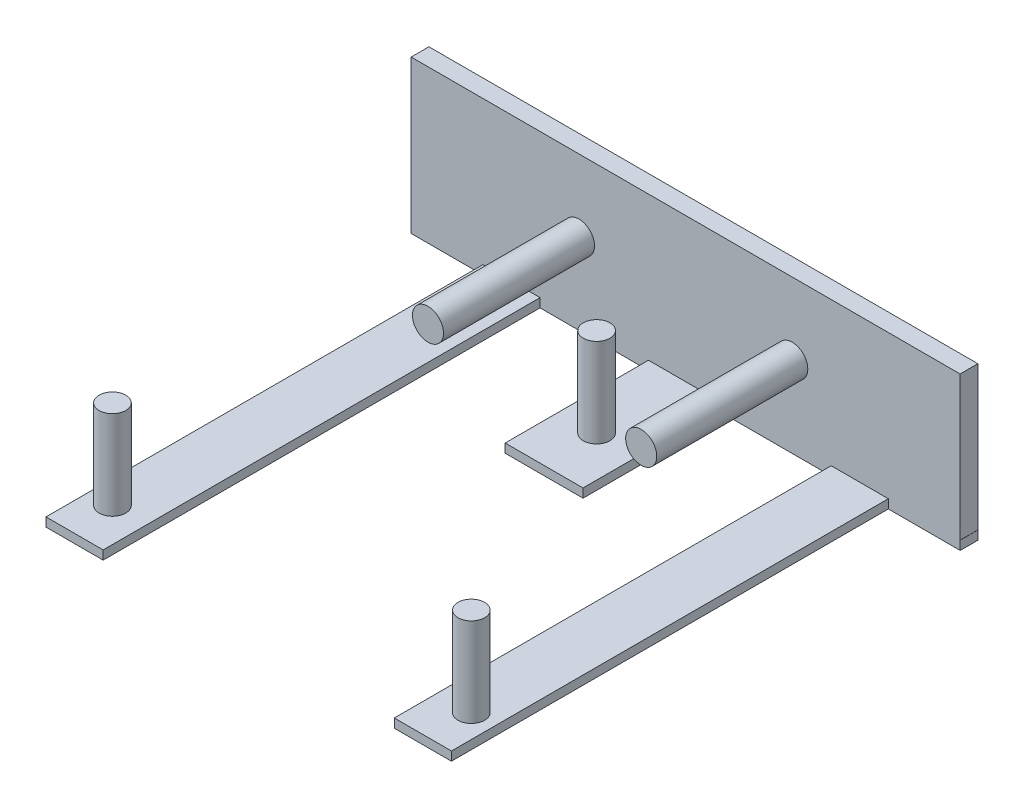
ISO-10303-21;
HEADER;
FILE_DESCRIPTION(('STEP AP214'),'2;1');
FILE_NAME('part.step','',(''),(''),'','','');
FILE_SCHEMA(('AUTOMOTIVE_DESIGN { 1 0 10303 214 1 1 1 1 }'));
ENDSEC;
DATA;
#1=APPLICATION_CONTEXT('core data for automotive mechanical design processes');
#2=APPLICATION_PROTOCOL_DEFINITION('international standard','automotive_design',2000,#1);
#3=PRODUCT_CONTEXT('',#1,'mechanical');
#4=PRODUCT('Part','Part','',(#3));
#5=PRODUCT_RELATED_PRODUCT_CATEGORY('part','',(#4));
#6=PRODUCT_DEFINITION_FORMATION('','',#4);
#7=PRODUCT_DEFINITION_CONTEXT('part definition',#1,'design');
#8=PRODUCT_DEFINITION('design','',#6,#7);
#9=PRODUCT_DEFINITION_SHAPE('','',#8);
#10=(LENGTH_UNIT() NAMED_UNIT(*) SI_UNIT(.MILLI.,.METRE.));
#11=(NAMED_UNIT(*) PLANE_ANGLE_UNIT() SI_UNIT($,.RADIAN.));
#12=(NAMED_UNIT(*) SI_UNIT($,.STERADIAN.) SOLID_ANGLE_UNIT());
#13=UNCERTAINTY_MEASURE_WITH_UNIT(LENGTH_MEASURE(1.E-05),#10,'distance_accuracy_value','');
#14=(GEOMETRIC_REPRESENTATION_CONTEXT(3) GLOBAL_UNCERTAINTY_ASSIGNED_CONTEXT((#13)) GLOBAL_UNIT_ASSIGNED_CONTEXT((#10,
#11,#12)) REPRESENTATION_CONTEXT('',''));
#15=CARTESIAN_POINT('',(0.,0.,0.));
#16=DIRECTION('',(0.,0.,1.));
#17=DIRECTION('',(1.,0.,0.));
#18=AXIS2_PLACEMENT_3D('',#15,#16,#17);
#19=CARTESIAN_POINT('',(11.1297221585432,-14.732,-43.18));
#20=DIRECTION('',(-1.,0.,0.));
#21=DIRECTION('',(0.,0.,1.));
#22=AXIS2_PLACEMENT_3D('',#19,#20,#21);
#23=PLANE('',#22);
#24=DIRECTION('',(0.,-1.,0.));
#25=VECTOR('',#24,1.);
#26=CARTESIAN_POINT('',(11.1297221585432,-14.732,-38.1));
#27=LINE('',#26,#25);
#28=CARTESIAN_POINT('',(11.1297221585432,-12.192,-38.1));
#29=VERTEX_POINT('',#28);
#30=CARTESIAN_POINT('',(11.1297221585432,-14.732,-38.1));
#31=VERTEX_POINT('',#30);
#32=EDGE_CURVE('E208',#29,#31,#27,.T.);
#33=ORIENTED_EDGE('',*,*,#32,.F.);
#34=DIRECTION('',(0.,0.,1.));
#35=VECTOR('',#34,1.);
#36=CARTESIAN_POINT('',(11.1297221585432,-12.192,-43.18));
#37=LINE('',#36,#35);
#38=CARTESIAN_POINT('',(11.1297221585432,-12.192,2.87258329002782));
#39=VERTEX_POINT('',#38);
#40=EDGE_CURVE('E248',#29,#39,#37,.T.);
#41=ORIENTED_EDGE('',*,*,#40,.T.);
#42=DIRECTION('',(0.,1.,0.));
#43=VECTOR('',#42,1.);
#44=CARTESIAN_POINT('',(11.1297221585432,-14.732,2.87258329002782));
#45=LINE('',#44,#43);
#46=CARTESIAN_POINT('',(11.1297221585432,-14.732,2.87258329002782));
#47=VERTEX_POINT('',#46);
#48=EDGE_CURVE('E265',#47,#39,#45,.T.);
#49=ORIENTED_EDGE('',*,*,#48,.F.);
#50=DIRECTION('',(0.,0.,1.));
#51=VECTOR('',#50,1.);
#52=CARTESIAN_POINT('',(11.1297221585432,-14.732,-43.18));
#53=LINE('',#52,#51);
#54=EDGE_CURVE('E48',#31,#47,#53,.T.);
#55=ORIENTED_EDGE('',*,*,#54,.F.);
#56=EDGE_LOOP('',(#33,#41,#49,#55));
#57=FACE_BOUND('',#56,.T.);
#58=ADVANCED_FACE('F33',(#57),#23,.F.);
#59=CARTESIAN_POINT('',(-11.1297221585431,-14.732,-43.18));
#60=DIRECTION('',(1.,0.,0.));
#61=DIRECTION('',(0.,0.,-1.));
#62=AXIS2_PLACEMENT_3D('',#59,#60,#61);
#63=PLANE('',#62);
#64=DIRECTION('',(0.,1.,0.));
#65=VECTOR('',#64,1.);
#66=CARTESIAN_POINT('',(-11.1297221585431,-14.732,-38.1));
#67=LINE('',#66,#65);
#68=CARTESIAN_POINT('',(-11.1297221585431,-14.732,-38.1));
#69=VERTEX_POINT('',#68);
#70=CARTESIAN_POINT('',(-11.1297221585431,-12.192,-38.1));
#71=VERTEX_POINT('',#70);
#72=EDGE_CURVE('E206',#69,#71,#67,.T.);
#73=ORIENTED_EDGE('',*,*,#72,.F.);
#74=DIRECTION('',(0.,0.,-1.));
#75=VECTOR('',#74,1.);
#76=CARTESIAN_POINT('',(-11.1297221585431,-14.732,-43.18));
#77=LINE('',#76,#75);
#78=CARTESIAN_POINT('',(-11.1297221585431,-14.732,2.87258329002782));
#79=VERTEX_POINT('',#78);
#80=EDGE_CURVE('E253',#79,#69,#77,.T.);
#81=ORIENTED_EDGE('',*,*,#80,.F.);
#82=DIRECTION('',(0.,1.,0.));
#83=VECTOR('',#82,1.);
#84=CARTESIAN_POINT('',(-11.1297221585431,-14.732,2.87258329002782));
#85=LINE('',#84,#83);
#86=CARTESIAN_POINT('',(-11.1297221585431,-12.192,2.87258329002782));
#87=VERTEX_POINT('',#86);
#88=EDGE_CURVE('E257',#79,#87,#85,.T.);
#89=ORIENTED_EDGE('',*,*,#88,.T.);
#90=DIRECTION('',(0.,0.,-1.));
#91=VECTOR('',#90,1.);
#92=CARTESIAN_POINT('',(-11.1297221585431,-12.192,-43.18));
#93=LINE('',#92,#91);
#94=EDGE_CURVE('E251',#87,#71,#93,.T.);
#95=ORIENTED_EDGE('',*,*,#94,.T.);
#96=EDGE_LOOP('',(#73,#81,#89,#95));
#97=FACE_BOUND('',#96,.T.);
#98=ADVANCED_FACE('F320',(#97),#63,.F.);
#99=CARTESIAN_POINT('',(-58.4650440307115,-14.732,-43.18));
#100=DIRECTION('',(1.,0.,0.));
#101=DIRECTION('',(0.,0.,-1.));
#102=AXIS2_PLACEMENT_3D('',#99,#100,#101);
#103=PLANE('',#102);
#104=DIRECTION('',(0.,1.,0.));
#105=VECTOR('',#104,1.);
#106=CARTESIAN_POINT('',(-58.4650440307115,-14.732,-38.1));
#107=LINE('',#106,#105);
#108=CARTESIAN_POINT('',(-58.4650440307115,-14.732,-38.1));
#109=VERTEX_POINT('',#108);
#110=CARTESIAN_POINT('',(-58.4650440307115,-12.192,-38.1));
#111=VERTEX_POINT('',#110);
#112=EDGE_CURVE('E204',#109,#111,#107,.T.);
#113=ORIENTED_EDGE('',*,*,#112,.F.);
#114=DIRECTION('',(0.,0.,-1.));
#115=VECTOR('',#114,1.);
#116=CARTESIAN_POINT('',(-58.4650440307115,-14.732,-43.18));
#117=LINE('',#116,#115);
#118=CARTESIAN_POINT('',(-58.4650440307115,-14.732,86.8038586522886));
#119=VERTEX_POINT('',#118);
#120=EDGE_CURVE('E175',#119,#109,#117,.T.);
#121=ORIENTED_EDGE('',*,*,#120,.F.);
#122=DIRECTION('',(0.,1.,0.));
#123=VECTOR('',#122,1.);
#124=CARTESIAN_POINT('',(-58.4650440307115,-14.732,86.8038586522886));
#125=LINE('',#124,#123);
#126=CARTESIAN_POINT('',(-58.4650440307115,-12.192,86.8038586522886));
#127=VERTEX_POINT('',#126);
#128=EDGE_CURVE('E237',#119,#127,#125,.T.);
#129=ORIENTED_EDGE('',*,*,#128,.T.);
#130=DIRECTION('',(0.,0.,-1.));
#131=VECTOR('',#130,1.);
#132=CARTESIAN_POINT('',(-58.4650440307115,-12.192,-43.18));
#133=LINE('',#132,#131);
#134=EDGE_CURVE('E230',#127,#111,#133,.T.);
#135=ORIENTED_EDGE('',*,*,#134,.T.);
#136=EDGE_LOOP('',(#113,#121,#129,#135));
#137=FACE_BOUND('',#136,.T.);
#138=ADVANCED_FACE('F325',(#137),#103,.F.);
#139=CARTESIAN_POINT('',(-42.1262051769054,-14.732,-43.18));
#140=DIRECTION('',(-1.,0.,0.));
#141=DIRECTION('',(0.,0.,1.));
#142=AXIS2_PLACEMENT_3D('',#139,#140,#141);
#143=PLANE('',#142);
#144=DIRECTION('',(0.,-1.,0.));
#145=VECTOR('',#144,1.);
#146=CARTESIAN_POINT('',(-42.1262051769054,-14.732,-38.1));
#147=LINE('',#146,#145);
#148=CARTESIAN_POINT('',(-42.1262051769054,-12.192,-38.1));
#149=VERTEX_POINT('',#148);
#150=CARTESIAN_POINT('',(-42.1262051769054,-14.732,-38.1));
#151=VERTEX_POINT('',#150);
#152=EDGE_CURVE('E202',#149,#151,#147,.T.);
#153=ORIENTED_EDGE('',*,*,#152,.F.);
#154=DIRECTION('',(0.,0.,1.));
#155=VECTOR('',#154,1.);
#156=CARTESIAN_POINT('',(-42.1262051769054,-12.192,-43.18));
#157=LINE('',#156,#155);
#158=CARTESIAN_POINT('',(-42.1262051769054,-12.192,86.8038586522886));
#159=VERTEX_POINT('',#158);
#160=EDGE_CURVE('E240',#149,#159,#157,.T.);
#161=ORIENTED_EDGE('',*,*,#160,.T.);
#162=DIRECTION('',(0.,1.,0.));
#163=VECTOR('',#162,1.);
#164=CARTESIAN_POINT('',(-42.1262051769054,-14.732,86.8038586522886));
#165=LINE('',#164,#163);
#166=CARTESIAN_POINT('',(-42.1262051769054,-14.732,86.8038586522886));
#167=VERTEX_POINT('',#166);
#168=EDGE_CURVE('E245',#167,#159,#165,.T.);
#169=ORIENTED_EDGE('',*,*,#168,.F.);
#170=DIRECTION('',(0.,0.,1.));
#171=VECTOR('',#170,1.);
#172=CARTESIAN_POINT('',(-42.1262051769054,-14.732,-43.18));
#173=LINE('',#172,#171);
#174=EDGE_CURVE('E232',#151,#167,#173,.T.);
#175=ORIENTED_EDGE('',*,*,#174,.F.);
#176=EDGE_LOOP('',(#153,#161,#169,#175));
#177=FACE_BOUND('',#176,.T.);
#178=ADVANCED_FACE('F400',(#177),#143,.F.);
#179=CARTESIAN_POINT('',(57.4432840372022,-14.732,-43.1800000000001));
#180=DIRECTION('',(1.,0.,0.));
#181=DIRECTION('',(0.,0.,-1.));
#182=AXIS2_PLACEMENT_3D('',#179,#180,#181);
#183=PLANE('',#182);
#184=DIRECTION('',(0.,0.,-1.));
#185=VECTOR('',#184,1.);
#186=CARTESIAN_POINT('',(57.4432840372022,-14.732,-43.1800000000001));
#187=LINE('',#186,#185);
#188=CARTESIAN_POINT('',(57.4432840372024,-14.732,86.8038586522885));
#189=VERTEX_POINT('',#188);
#190=CARTESIAN_POINT('',(57.4432840372022,-14.732,-38.1));
#191=VERTEX_POINT('',#190);
#192=EDGE_CURVE('E211',#189,#191,#187,.T.);
#193=ORIENTED_EDGE('',*,*,#192,.T.);
#194=DIRECTION('',(0.,1.,0.));
#195=VECTOR('',#194,1.);
#196=CARTESIAN_POINT('',(57.4432840372022,-14.732,-38.1));
#197=LINE('',#196,#195);
#198=CARTESIAN_POINT('',(57.4432840372024,-12.192,-38.1));
#199=VERTEX_POINT('',#198);
#200=EDGE_CURVE('E200',#191,#199,#197,.T.);
#201=ORIENTED_EDGE('',*,*,#200,.T.);
#202=DIRECTION('',(0.,0.,-1.));
#203=VECTOR('',#202,1.);
#204=CARTESIAN_POINT('',(57.4432840372022,-12.192,-43.1800000000001));
#205=LINE('',#204,#203);
#206=CARTESIAN_POINT('',(57.4432840372024,-12.192,86.8038586522885));
#207=VERTEX_POINT('',#206);
#208=EDGE_CURVE('E210',#207,#199,#205,.T.);
#209=ORIENTED_EDGE('',*,*,#208,.F.);
#210=DIRECTION('',(0.,1.,0.));
#211=VECTOR('',#210,1.);
#212=CARTESIAN_POINT('',(57.4432840372024,-14.732,86.8038586522885));
#213=LINE('',#212,#211);
#214=EDGE_CURVE('E228',#189,#207,#213,.T.);
#215=ORIENTED_EDGE('',*,*,#214,.F.);
#216=EDGE_LOOP('',(#193,#201,#209,#215));
#217=FACE_BOUND('',#216,.T.);
#218=ADVANCED_FACE('F402',(#217),#183,.T.);
#219=CARTESIAN_POINT('',(41.1044451833961,-14.732,-43.1800000000001));
#220=DIRECTION('',(-1.,0.,0.));
#221=DIRECTION('',(0.,0.,1.));
#222=AXIS2_PLACEMENT_3D('',#219,#220,#221);
#223=PLANE('',#222);
#224=DIRECTION('',(0.,0.,1.));
#225=VECTOR('',#224,1.);
#226=CARTESIAN_POINT('',(41.1044451833961,-12.192,-43.1800000000001));
#227=LINE('',#226,#225);
#228=CARTESIAN_POINT('',(41.1044451833961,-12.192,-38.1));
#229=VERTEX_POINT('',#228);
#230=CARTESIAN_POINT('',(41.1044451833963,-12.192,86.8038586522885));
#231=VERTEX_POINT('',#230);
#232=EDGE_CURVE('E214',#229,#231,#227,.T.);
#233=ORIENTED_EDGE('',*,*,#232,.F.);
#234=DIRECTION('',(0.,-1.,0.));
#235=VECTOR('',#234,1.);
#236=CARTESIAN_POINT('',(41.1044451833961,-14.732,-38.1));
#237=LINE('',#236,#235);
#238=CARTESIAN_POINT('',(41.1044451833961,-14.732,-38.1));
#239=VERTEX_POINT('',#238);
#240=EDGE_CURVE('E197',#229,#239,#237,.T.);
#241=ORIENTED_EDGE('',*,*,#240,.T.);
#242=DIRECTION('',(0.,0.,1.));
#243=VECTOR('',#242,1.);
#244=CARTESIAN_POINT('',(41.1044451833961,-14.732,-43.1800000000001));
#245=LINE('',#244,#243);
#246=CARTESIAN_POINT('',(41.1044451833963,-14.732,86.8038586522885));
#247=VERTEX_POINT('',#246);
#248=EDGE_CURVE('E217',#239,#247,#245,.T.);
#249=ORIENTED_EDGE('',*,*,#248,.T.);
#250=DIRECTION('',(0.,1.,0.));
#251=VECTOR('',#250,1.);
#252=CARTESIAN_POINT('',(41.1044451833963,-14.732,86.8038586522885));
#253=LINE('',#252,#251);
#254=EDGE_CURVE('E219',#247,#231,#253,.T.);
#255=ORIENTED_EDGE('',*,*,#254,.T.);
#256=EDGE_LOOP('',(#233,#241,#249,#255));
#257=FACE_BOUND('',#256,.T.);
#258=ADVANCED_FACE('F310',(#257),#223,.T.);
#259=CARTESIAN_POINT('',(29.9691200032454,8.382,-38.1));
#260=DIRECTION('',(0.,0.,1.));
#261=DIRECTION('',(1.,0.,0.));
#262=AXIS2_PLACEMENT_3D('',#259,#260,#261);
#263=CYLINDRICAL_SURFACE('',#262,4.445);
#264=CARTESIAN_POINT('',(29.9691200032454,8.382,-38.1));
#265=DIRECTION('',(0.,0.,1.));
#266=DIRECTION('',(1.,0.,0.));
#267=AXIS2_PLACEMENT_3D('',#264,#265,#266);
#268=CIRCLE('',#267,4.445);
#269=CARTESIAN_POINT('',(34.4141200032454,8.382,-38.1));
#270=VERTEX_POINT('',#269);
#271=EDGE_CURVE('E290',#270,#270,#268,.F.);
#272=ORIENTED_EDGE('',*,*,#271,.F.);
#273=EDGE_LOOP('',(#272));
#274=FACE_BOUND('',#273,.T.);
#275=CARTESIAN_POINT('',(29.9691200032454,8.382,5.08));
#276=DIRECTION('',(0.,0.,1.));
#277=DIRECTION('',(1.,0.,0.));
#278=AXIS2_PLACEMENT_3D('',#275,#276,#277);
#279=CIRCLE('',#278,4.445);
#280=CARTESIAN_POINT('',(34.4141200032454,8.382,5.08));
#281=VERTEX_POINT('',#280);
#282=EDGE_CURVE('E293',#281,#281,#279,.T.);
#283=ORIENTED_EDGE('',*,*,#282,.F.);
#284=EDGE_LOOP('',(#283));
#285=FACE_BOUND('',#284,.T.);
#286=ADVANCED_FACE('F35',(#274,#285),#263,.T.);
#287=CARTESIAN_POINT('',(29.9691200032454,8.382,5.08));
#288=DIRECTION('',(0.,0.,1.));
#289=DIRECTION('',(1.,0.,0.));
#290=AXIS2_PLACEMENT_3D('',#287,#288,#289);
#291=PLANE('',#290);
#292=ORIENTED_EDGE('',*,*,#282,.T.);
#293=EDGE_LOOP('',(#292));
#294=FACE_BOUND('',#293,.T.);
#295=ADVANCED_FACE('F309',(#294),#291,.T.);
#296=CARTESIAN_POINT('',(-78.9758169935736,-12.192,-43.18));
#297=DIRECTION('',(1.,0.,0.));
#298=DIRECTION('',(0.,0.,-1.));
#299=AXIS2_PLACEMENT_3D('',#296,#297,#298);
#300=PLANE('',#299);
#301=DIRECTION('',(0.,1.,0.));
#302=VECTOR('',#301,1.);
#303=CARTESIAN_POINT('',(-78.9758169935736,-12.192,-38.1));
#304=LINE('',#303,#302);
#305=CARTESIAN_POINT('',(-78.9758169935736,-14.732,-38.1));
#306=VERTEX_POINT('',#305);
#307=CARTESIAN_POINT('',(-78.9758169935736,28.956,-38.1));
#308=VERTEX_POINT('',#307);
#309=EDGE_CURVE('E157',#306,#308,#304,.T.);
#310=ORIENTED_EDGE('',*,*,#309,.T.);
#311=DIRECTION('',(0.,0.,1.));
#312=VECTOR('',#311,1.);
#313=CARTESIAN_POINT('',(-78.9758169935736,28.956,-43.18));
#314=LINE('',#313,#312);
#315=CARTESIAN_POINT('',(-78.9758169935736,28.956,-43.18));
#316=VERTEX_POINT('',#315);
#317=EDGE_CURVE('E288',#316,#308,#314,.T.);
#318=ORIENTED_EDGE('',*,*,#317,.F.);
#319=DIRECTION('',(0.,1.,0.));
#320=VECTOR('',#319,1.);
#321=CARTESIAN_POINT('',(-78.9758169935736,-12.192,-43.18));
#322=LINE('',#321,#320);
#323=CARTESIAN_POINT('',(-78.9758169935736,-14.732,-43.18));
#324=VERTEX_POINT('',#323);
#325=EDGE_CURVE('E181',#324,#316,#322,.T.);
#326=ORIENTED_EDGE('',*,*,#325,.F.);
#327=DIRECTION('',(0.,0.,-1.));
#328=VECTOR('',#327,1.);
#329=CARTESIAN_POINT('',(-78.9758169935736,-14.732,-43.18));
#330=LINE('',#329,#328);
#331=EDGE_CURVE('E173',#306,#324,#330,.T.);
#332=ORIENTED_EDGE('',*,*,#331,.F.);
#333=EDGE_LOOP('',(#310,#318,#326,#332));
#334=FACE_BOUND('',#333,.T.);
#335=ADVANCED_FACE('F179',(#334),#300,.F.);
#336=CARTESIAN_POINT('',(77.9540570000643,28.956,-43.18));
#337=DIRECTION('',(0.,-1.,0.));
#338=DIRECTION('',(0.,0.,-1.));
#339=AXIS2_PLACEMENT_3D('',#336,#337,#338);
#340=PLANE('',#339);
#341=DIRECTION('',(1.,0.,0.));
#342=VECTOR('',#341,1.);
#343=CARTESIAN_POINT('',(77.9540570000643,28.956,-38.1));
#344=LINE('',#343,#342);
#345=CARTESIAN_POINT('',(77.9540570000643,28.956,-38.1));
#346=VERTEX_POINT('',#345);
#347=EDGE_CURVE('E163',#308,#346,#344,.T.);
#348=ORIENTED_EDGE('',*,*,#347,.T.);
#349=DIRECTION('',(0.,0.,1.));
#350=VECTOR('',#349,1.);
#351=CARTESIAN_POINT('',(77.9540570000643,28.956,-43.18));
#352=LINE('',#351,#350);
#353=CARTESIAN_POINT('',(77.9540570000643,28.956,-43.18));
#354=VERTEX_POINT('',#353);
#355=EDGE_CURVE('E285',#354,#346,#352,.T.);
#356=ORIENTED_EDGE('',*,*,#355,.F.);
#357=DIRECTION('',(1.,0.,0.));
#358=VECTOR('',#357,1.);
#359=CARTESIAN_POINT('',(77.9540570000643,28.956,-43.18));
#360=LINE('',#359,#358);
#361=EDGE_CURVE('E271',#316,#354,#360,.T.);
#362=ORIENTED_EDGE('',*,*,#361,.F.);
#363=ORIENTED_EDGE('',*,*,#317,.T.);
#364=EDGE_LOOP('',(#348,#356,#362,#363));
#365=FACE_BOUND('',#364,.T.);
#366=ADVANCED_FACE('F317',(#365),#340,.F.);
#367=CARTESIAN_POINT('',(77.9540570000643,-12.192,-43.18));
#368=DIRECTION('',(-1.,0.,0.));
#369=DIRECTION('',(0.,0.,1.));
#370=AXIS2_PLACEMENT_3D('',#367,#368,#369);
#371=PLANE('',#370);
#372=DIRECTION('',(0.,-1.,0.));
#373=VECTOR('',#372,1.);
#374=CARTESIAN_POINT('',(77.9540570000643,-12.192,-38.1));
#375=LINE('',#374,#373);
#376=CARTESIAN_POINT('',(77.9540570000643,-12.192,-38.1));
#377=VERTEX_POINT('',#376);
#378=EDGE_CURVE('E278',#346,#377,#375,.T.);
#379=ORIENTED_EDGE('',*,*,#378,.T.);
#380=DIRECTION('',(0.,0.,1.));
#381=VECTOR('',#380,1.);
#382=CARTESIAN_POINT('',(77.9540570000643,-12.192,-43.18));
#383=LINE('',#382,#381);
#384=CARTESIAN_POINT('',(77.9540570000643,-12.192,-43.18));
#385=VERTEX_POINT('',#384);
#386=EDGE_CURVE('E275',#385,#377,#383,.T.);
#387=ORIENTED_EDGE('',*,*,#386,.F.);
#388=DIRECTION('',(0.,-1.,0.));
#389=VECTOR('',#388,1.);
#390=CARTESIAN_POINT('',(77.9540570000643,-12.192,-43.18));
#391=LINE('',#390,#389);
#392=EDGE_CURVE('E274',#354,#385,#391,.T.);
#393=ORIENTED_EDGE('',*,*,#392,.F.);
#394=ORIENTED_EDGE('',*,*,#355,.T.);
#395=EDGE_LOOP('',(#379,#387,#393,#394));
#396=FACE_BOUND('',#395,.T.);
#397=ADVANCED_FACE('F338',(#396),#371,.F.);
#398=CARTESIAN_POINT('',(0.,0.,-43.18));
#399=DIRECTION('',(0.,0.,1.));
#400=DIRECTION('',(1.,0.,0.));
#401=AXIS2_PLACEMENT_3D('',#398,#399,#400);
#402=PLANE('',#401);
#403=DIRECTION('',(1.,0.,0.));
#404=VECTOR('',#403,1.);
#405=CARTESIAN_POINT('',(-11.1297221585431,-14.732,-43.18));
#406=LINE('',#405,#404);
#407=CARTESIAN_POINT('',(77.9954892461348,-14.732,-43.18));
#408=VERTEX_POINT('',#407);
#409=EDGE_CURVE('E255',#324,#408,#406,.T.);
#410=ORIENTED_EDGE('',*,*,#409,.F.);
#411=ORIENTED_EDGE('',*,*,#325,.T.);
#412=ORIENTED_EDGE('',*,*,#361,.T.);
#413=ORIENTED_EDGE('',*,*,#392,.T.);
#414=DIRECTION('',(1.,0.,0.));
#415=VECTOR('',#414,1.);
#416=CARTESIAN_POINT('',(-78.9758169935736,-12.192,-43.18));
#417=LINE('',#416,#415);
#418=CARTESIAN_POINT('',(77.9954892461348,-12.192,-43.18));
#419=VERTEX_POINT('',#418);
#420=EDGE_CURVE('E195',#385,#419,#417,.T.);
#421=ORIENTED_EDGE('',*,*,#420,.T.);
#422=DIRECTION('',(0.,1.,0.));
#423=VECTOR('',#422,1.);
#424=CARTESIAN_POINT('',(77.9954892461348,-171.785485738459,-43.18));
#425=LINE('',#424,#423);
#426=EDGE_CURVE('E191',#408,#419,#425,.T.);
#427=ORIENTED_EDGE('',*,*,#426,.F.);
#428=EDGE_LOOP('',(#410,#411,#412,#413,#421,#427));
#429=FACE_BOUND('',#428,.T.);
#430=ADVANCED_FACE('F303',(#429),#402,.F.);
#431=CARTESIAN_POINT('',(0.,0.,-38.1));
#432=DIRECTION('',(0.,0.,1.));
#433=DIRECTION('',(1.,0.,0.));
#434=AXIS2_PLACEMENT_3D('',#431,#432,#433);
#435=PLANE('',#434);
#436=CARTESIAN_POINT('',(-30.9908799967547,8.382,-38.1));
#437=DIRECTION('',(0.,0.,1.));
#438=DIRECTION('',(1.,0.,0.));
#439=AXIS2_PLACEMENT_3D('',#436,#437,#438);
#440=CIRCLE('',#439,4.445);
#441=CARTESIAN_POINT('',(-26.5458799967547,8.382,-38.1));
#442=VERTEX_POINT('',#441);
#443=EDGE_CURVE('E41',#442,#442,#440,.T.);
#444=ORIENTED_EDGE('',*,*,#443,.F.);
#445=EDGE_LOOP('',(#444));
#446=FACE_BOUND('',#445,.T.);
#447=ORIENTED_EDGE('',*,*,#271,.T.);
#448=EDGE_LOOP('',(#447));
#449=FACE_BOUND('',#448,.T.);
#450=ORIENTED_EDGE('',*,*,#309,.F.);
#451=DIRECTION('',(-1.,0.,0.));
#452=VECTOR('',#451,1.);
#453=CARTESIAN_POINT('',(-78.9758169935736,-14.732,-38.1));
#454=LINE('',#453,#452);
#455=EDGE_CURVE('E160',#109,#306,#454,.T.);
#456=ORIENTED_EDGE('',*,*,#455,.F.);
#457=ORIENTED_EDGE('',*,*,#112,.T.);
#458=DIRECTION('',(-1.,0.,0.));
#459=VECTOR('',#458,1.);
#460=CARTESIAN_POINT('',(77.9540570000643,-12.192,-38.1));
#461=LINE('',#460,#459);
#462=EDGE_CURVE('E280',#149,#111,#461,.T.);
#463=ORIENTED_EDGE('',*,*,#462,.F.);
#464=ORIENTED_EDGE('',*,*,#152,.T.);
#465=EDGE_CURVE('E56',#69,#151,#454,.T.);
#466=ORIENTED_EDGE('',*,*,#465,.F.);
#467=ORIENTED_EDGE('',*,*,#72,.T.);
#468=EDGE_CURVE('E282',#29,#71,#461,.T.);
#469=ORIENTED_EDGE('',*,*,#468,.F.);
#470=ORIENTED_EDGE('',*,*,#32,.T.);
#471=EDGE_CURVE('E366',#239,#31,#454,.T.);
#472=ORIENTED_EDGE('',*,*,#471,.F.);
#473=ORIENTED_EDGE('',*,*,#240,.F.);
#474=EDGE_CURVE('E272',#199,#229,#461,.T.);
#475=ORIENTED_EDGE('',*,*,#474,.F.);
#476=ORIENTED_EDGE('',*,*,#200,.F.);
#477=CARTESIAN_POINT('',(77.9954892461348,-14.732,-38.1));
#478=VERTEX_POINT('',#477);
#479=EDGE_CURVE('E178',#478,#191,#454,.T.);
#480=ORIENTED_EDGE('',*,*,#479,.F.);
#481=DIRECTION('',(0.,1.,0.));
#482=VECTOR('',#481,1.);
#483=CARTESIAN_POINT('',(77.9954892461348,-171.785485738459,-38.1));
#484=LINE('',#483,#482);
#485=CARTESIAN_POINT('',(77.9954892461348,-12.192,-38.1));
#486=VERTEX_POINT('',#485);
#487=EDGE_CURVE('E188',#478,#486,#484,.T.);
#488=ORIENTED_EDGE('',*,*,#487,.T.);
#489=DIRECTION('',(-1.,0.,0.));
#490=VECTOR('',#489,1.);
#491=CARTESIAN_POINT('',(-78.9758169935736,-12.192,-38.1));
#492=LINE('',#491,#490);
#493=EDGE_CURVE('E183',#486,#377,#492,.T.);
#494=ORIENTED_EDGE('',*,*,#493,.T.);
#495=ORIENTED_EDGE('',*,*,#378,.F.);
#496=ORIENTED_EDGE('',*,*,#347,.F.);
#497=EDGE_LOOP('',(#450,#456,#457,#463,#464,#466,#467,#469,#470,#472,#473,#475,#476,#480,#488,
#494,#495,#496));
#498=FACE_BOUND('',#497,.T.);
#499=ADVANCED_FACE('F159',(#446,#449,#498),#435,.T.);
#500=CARTESIAN_POINT('',(-30.9908799967547,8.382,-38.1));
#501=DIRECTION('',(0.,0.,1.));
#502=DIRECTION('',(-1.,0.,0.));
#503=AXIS2_PLACEMENT_3D('',#500,#501,#502);
#504=CYLINDRICAL_SURFACE('',#503,4.445);
#505=ORIENTED_EDGE('',*,*,#443,.T.);
#506=EDGE_LOOP('',(#505));
#507=FACE_BOUND('',#506,.T.);
#508=CARTESIAN_POINT('',(-30.9908799967546,8.382,5.08000000000005));
#509=DIRECTION('',(0.,0.,-1.));
#510=DIRECTION('',(-1.,0.,0.));
#511=AXIS2_PLACEMENT_3D('',#508,#509,#510);
#512=CIRCLE('',#511,4.445);
#513=CARTESIAN_POINT('',(-35.4358799967546,8.382,5.08000000000006));
#514=VERTEX_POINT('',#513);
#515=EDGE_CURVE('E168',#514,#514,#512,.T.);
#516=ORIENTED_EDGE('',*,*,#515,.T.);
#517=EDGE_LOOP('',(#516));
#518=FACE_BOUND('',#517,.T.);
#519=ADVANCED_FACE('F298',(#507,#518),#504,.T.);
#520=CARTESIAN_POINT('',(-30.9908799967546,8.382,5.08000000000005));
#521=DIRECTION('',(0.,0.,1.));
#522=DIRECTION('',(-1.,0.,0.));
#523=AXIS2_PLACEMENT_3D('',#520,#521,#522);
#524=PLANE('',#523);
#525=ORIENTED_EDGE('',*,*,#515,.F.);
#526=EDGE_LOOP('',(#525));
#527=FACE_BOUND('',#526,.T.);
#528=ADVANCED_FACE('F331',(#527),#524,.T.);
#529=CARTESIAN_POINT('',(-11.1297221585431,-14.732,2.87258329002782));
#530=DIRECTION('',(0.,0.,-1.));
#531=DIRECTION('',(-1.,0.,0.));
#532=AXIS2_PLACEMENT_3D('',#529,#530,#531);
#533=PLANE('',#532);
#534=DIRECTION('',(-1.,0.,0.));
#535=VECTOR('',#534,1.);
#536=CARTESIAN_POINT('',(-11.1297221585431,-12.192,2.87258329002782));
#537=LINE('',#536,#535);
#538=EDGE_CURVE('E259',#39,#87,#537,.T.);
#539=ORIENTED_EDGE('',*,*,#538,.T.);
#540=ORIENTED_EDGE('',*,*,#88,.F.);
#541=DIRECTION('',(-1.,0.,0.));
#542=VECTOR('',#541,1.);
#543=CARTESIAN_POINT('',(-11.1297221585431,-14.732,2.87258329002782));
#544=LINE('',#543,#542);
#545=EDGE_CURVE('E250',#47,#79,#544,.T.);
#546=ORIENTED_EDGE('',*,*,#545,.F.);
#547=ORIENTED_EDGE('',*,*,#48,.T.);
#548=EDGE_LOOP('',(#539,#540,#546,#547));
#549=FACE_BOUND('',#548,.T.);
#550=ADVANCED_FACE('F330',(#549),#533,.F.);
#551=CARTESIAN_POINT('',(0.,-14.732,0.));
#552=DIRECTION('',(0.,1.,0.));
#553=DIRECTION('',(0.,0.,1.));
#554=AXIS2_PLACEMENT_3D('',#551,#552,#553);
#555=PLANE('',#554);
#556=ORIENTED_EDGE('',*,*,#409,.T.);
#557=DIRECTION('',(0.,0.,1.));
#558=VECTOR('',#557,1.);
#559=CARTESIAN_POINT('',(77.9954892461348,-14.732,-43.18));
#560=LINE('',#559,#558);
#561=EDGE_CURVE('E176',#408,#478,#560,.T.);
#562=ORIENTED_EDGE('',*,*,#561,.T.);
#563=ORIENTED_EDGE('',*,*,#479,.T.);
#564=ORIENTED_EDGE('',*,*,#192,.F.);
#565=DIRECTION('',(1.,0.,0.));
#566=VECTOR('',#565,1.);
#567=CARTESIAN_POINT('',(41.1044451833963,-14.732,86.8038586522885));
#568=LINE('',#567,#566);
#569=EDGE_CURVE('E213',#247,#189,#568,.T.);
#570=ORIENTED_EDGE('',*,*,#569,.F.);
#571=ORIENTED_EDGE('',*,*,#248,.F.);
#572=ORIENTED_EDGE('',*,*,#471,.T.);
#573=ORIENTED_EDGE('',*,*,#54,.T.);
#574=ORIENTED_EDGE('',*,*,#545,.T.);
#575=ORIENTED_EDGE('',*,*,#80,.T.);
#576=ORIENTED_EDGE('',*,*,#465,.T.);
#577=ORIENTED_EDGE('',*,*,#174,.T.);
#578=DIRECTION('',(-1.,0.,0.));
#579=VECTOR('',#578,1.);
#580=CARTESIAN_POINT('',(-42.1262051769054,-14.732,86.8038586522886));
#581=LINE('',#580,#579);
#582=EDGE_CURVE('E235',#167,#119,#581,.T.);
#583=ORIENTED_EDGE('',*,*,#582,.T.);
#584=ORIENTED_EDGE('',*,*,#120,.T.);
#585=ORIENTED_EDGE('',*,*,#455,.T.);
#586=ORIENTED_EDGE('',*,*,#331,.T.);
#587=EDGE_LOOP('',(#556,#562,#563,#564,#570,#571,#572,#573,#574,#575,#576,#577,#583,#584,#585,#586));
#588=FACE_BOUND('',#587,.T.);
#589=ADVANCED_FACE('F172',(#588),#555,.F.);
#590=CARTESIAN_POINT('',(0.,-12.192,0.));
#591=DIRECTION('',(0.,1.,0.));
#592=DIRECTION('',(0.,0.,1.));
#593=AXIS2_PLACEMENT_3D('',#590,#591,#592);
#594=PLANE('',#593);
#595=CARTESIAN_POINT('',(-0.510879996754636,-12.192,-12.6433361722467));
#596=DIRECTION('',(0.,1.,0.));
#597=DIRECTION('',(0.,0.,1.));
#598=AXIS2_PLACEMENT_3D('',#595,#596,#597);
#599=CIRCLE('',#598,3.81);
#600=CARTESIAN_POINT('',(-0.510879996754636,-12.192,-8.83333617224675));
#601=VERTEX_POINT('',#600);
#602=EDGE_CURVE('E362',#601,#601,#599,.T.);
#603=ORIENTED_EDGE('',*,*,#602,.F.);
#604=EDGE_LOOP('',(#603));
#605=FACE_BOUND('',#604,.T.);
#606=ORIENTED_EDGE('',*,*,#40,.F.);
#607=ORIENTED_EDGE('',*,*,#468,.T.);
#608=ORIENTED_EDGE('',*,*,#94,.F.);
#609=ORIENTED_EDGE('',*,*,#538,.F.);
#610=EDGE_LOOP('',(#606,#607,#608,#609));
#611=FACE_BOUND('',#610,.T.);
#612=ADVANCED_FACE('F380',(#605,#611),#594,.T.);
#613=CARTESIAN_POINT('',(-42.1262051769054,-14.732,86.8038586522886));
#614=DIRECTION('',(0.,0.,-1.));
#615=DIRECTION('',(-1.,0.,0.));
#616=AXIS2_PLACEMENT_3D('',#613,#614,#615);
#617=PLANE('',#616);
#618=DIRECTION('',(-1.,0.,0.));
#619=VECTOR('',#618,1.);
#620=CARTESIAN_POINT('',(-42.1262051769054,-12.192,86.8038586522886));
#621=LINE('',#620,#619);
#622=EDGE_CURVE('E233',#159,#127,#621,.T.);
#623=ORIENTED_EDGE('',*,*,#622,.T.);
#624=ORIENTED_EDGE('',*,*,#128,.F.);
#625=ORIENTED_EDGE('',*,*,#582,.F.);
#626=ORIENTED_EDGE('',*,*,#168,.T.);
#627=EDGE_LOOP('',(#623,#624,#625,#626));
#628=FACE_BOUND('',#627,.T.);
#629=ADVANCED_FACE('F396',(#628),#617,.F.);
#630=CARTESIAN_POINT('',(0.,-12.192,0.));
#631=DIRECTION('',(0.,-1.,0.));
#632=DIRECTION('',(0.,0.,-1.));
#633=AXIS2_PLACEMENT_3D('',#630,#631,#632);
#634=PLANE('',#633);
#635=CARTESIAN_POINT('',(-51.8143327186699,-12.192,74.463197467947));
#636=DIRECTION('',(0.,-1.,0.));
#637=DIRECTION('',(0.,0.,1.));
#638=AXIS2_PLACEMENT_3D('',#635,#636,#637);
#639=CIRCLE('',#638,3.81);
#640=CARTESIAN_POINT('',(-51.8143327186699,-12.192,78.273197467947));
#641=VERTEX_POINT('',#640);
#642=EDGE_CURVE('E432',#641,#641,#639,.T.);
#643=ORIENTED_EDGE('',*,*,#642,.T.);
#644=EDGE_LOOP('',(#643));
#645=FACE_BOUND('',#644,.T.);
#646=ORIENTED_EDGE('',*,*,#462,.T.);
#647=ORIENTED_EDGE('',*,*,#134,.F.);
#648=ORIENTED_EDGE('',*,*,#622,.F.);
#649=ORIENTED_EDGE('',*,*,#160,.F.);
#650=EDGE_LOOP('',(#646,#647,#648,#649));
#651=FACE_BOUND('',#650,.T.);
#652=ADVANCED_FACE('F390',(#645,#651),#634,.F.);
#653=CARTESIAN_POINT('',(41.1044451833963,-14.732,86.8038586522885));
#654=DIRECTION('',(0.,0.,1.));
#655=DIRECTION('',(1.,0.,0.));
#656=AXIS2_PLACEMENT_3D('',#653,#654,#655);
#657=PLANE('',#656);
#658=DIRECTION('',(1.,0.,0.));
#659=VECTOR('',#658,1.);
#660=CARTESIAN_POINT('',(41.1044451833963,-12.192,86.8038586522885));
#661=LINE('',#660,#659);
#662=EDGE_CURVE('E222',#231,#207,#661,.T.);
#663=ORIENTED_EDGE('',*,*,#662,.F.);
#664=ORIENTED_EDGE('',*,*,#254,.F.);
#665=ORIENTED_EDGE('',*,*,#569,.T.);
#666=ORIENTED_EDGE('',*,*,#214,.T.);
#667=EDGE_LOOP('',(#663,#664,#665,#666));
#668=FACE_BOUND('',#667,.T.);
#669=ADVANCED_FACE('F474',(#668),#657,.T.);
#670=CARTESIAN_POINT('',(-1.02175999350926,-12.192,0.));
#671=DIRECTION('',(0.,-1.,0.));
#672=DIRECTION('',(0.,0.,-1.));
#673=AXIS2_PLACEMENT_3D('',#670,#671,#672);
#674=PLANE('',#673);
#675=CARTESIAN_POINT('',(50.7925727251608,-12.192,74.4631974679469));
#676=DIRECTION('',(0.,-1.,0.));
#677=DIRECTION('',(0.,0.,-1.));
#678=AXIS2_PLACEMENT_3D('',#675,#676,#677);
#679=CIRCLE('',#678,3.81);
#680=CARTESIAN_POINT('',(50.7925727251608,-12.192,70.6531974679469));
#681=VERTEX_POINT('',#680);
#682=EDGE_CURVE('E11',#681,#681,#679,.F.);
#683=ORIENTED_EDGE('',*,*,#682,.F.);
#684=EDGE_LOOP('',(#683));
#685=FACE_BOUND('',#684,.T.);
#686=ORIENTED_EDGE('',*,*,#474,.T.);
#687=ORIENTED_EDGE('',*,*,#232,.T.);
#688=ORIENTED_EDGE('',*,*,#662,.T.);
#689=ORIENTED_EDGE('',*,*,#208,.T.);
#690=EDGE_LOOP('',(#686,#687,#688,#689));
#691=FACE_BOUND('',#690,.T.);
#692=ADVANCED_FACE('F470',(#685,#691),#674,.F.);
#693=CARTESIAN_POINT('',(77.9954892461348,-171.785485738459,-43.18));
#694=DIRECTION('',(-1.,0.,0.));
#695=DIRECTION('',(0.,0.,1.));
#696=AXIS2_PLACEMENT_3D('',#693,#694,#695);
#697=PLANE('',#696);
#698=ORIENTED_EDGE('',*,*,#561,.F.);
#699=ORIENTED_EDGE('',*,*,#426,.T.);
#700=DIRECTION('',(0.,0.,1.));
#701=VECTOR('',#700,1.);
#702=CARTESIAN_POINT('',(77.9954892461348,-12.192,-43.18));
#703=LINE('',#702,#701);
#704=EDGE_CURVE('E194',#419,#486,#703,.T.);
#705=ORIENTED_EDGE('',*,*,#704,.T.);
#706=ORIENTED_EDGE('',*,*,#487,.F.);
#707=EDGE_LOOP('',(#698,#699,#705,#706));
#708=FACE_BOUND('',#707,.T.);
#709=ADVANCED_FACE('F467',(#708),#697,.F.);
#710=CARTESIAN_POINT('',(0.,-12.192,0.));
#711=DIRECTION('',(0.,-1.,0.));
#712=DIRECTION('',(0.,0.,-1.));
#713=AXIS2_PLACEMENT_3D('',#710,#711,#712);
#714=PLANE('',#713);
#715=ORIENTED_EDGE('',*,*,#420,.F.);
#716=ORIENTED_EDGE('',*,*,#386,.T.);
#717=ORIENTED_EDGE('',*,*,#493,.F.);
#718=ORIENTED_EDGE('',*,*,#704,.F.);
#719=EDGE_LOOP('',(#715,#716,#717,#718));
#720=FACE_BOUND('',#719,.T.);
#721=ADVANCED_FACE('F357',(#720),#714,.F.);
#722=CARTESIAN_POINT('',(-0.510879996754636,13.208,-12.6433361722467));
#723=DIRECTION('',(0.,-1.,0.));
#724=DIRECTION('',(0.,0.,-1.));
#725=AXIS2_PLACEMENT_3D('',#722,#723,#724);
#726=CYLINDRICAL_SURFACE('',#725,3.81);
#727=CARTESIAN_POINT('',(-0.510879996754636,13.208,-12.6433361722467));
#728=DIRECTION('',(0.,1.,0.));
#729=DIRECTION('',(0.,0.,1.));
#730=AXIS2_PLACEMENT_3D('',#727,#728,#729);
#731=CIRCLE('',#730,3.81);
#732=CARTESIAN_POINT('',(-0.510879996754636,13.208,-8.83333617224675));
#733=VERTEX_POINT('',#732);
#734=EDGE_CURVE('E359',#733,#733,#731,.T.);
#735=ORIENTED_EDGE('',*,*,#734,.F.);
#736=EDGE_LOOP('',(#735));
#737=FACE_BOUND('',#736,.T.);
#738=ORIENTED_EDGE('',*,*,#602,.T.);
#739=EDGE_LOOP('',(#738));
#740=FACE_BOUND('',#739,.T.);
#741=ADVANCED_FACE('F460',(#737,#740),#726,.T.);
#742=CARTESIAN_POINT('',(-0.510879996754636,13.208,-12.6433361722467));
#743=DIRECTION('',(0.,1.,0.));
#744=DIRECTION('',(0.,0.,1.));
#745=AXIS2_PLACEMENT_3D('',#742,#743,#744);
#746=PLANE('',#745);
#747=ORIENTED_EDGE('',*,*,#734,.T.);
#748=EDGE_LOOP('',(#747));
#749=FACE_BOUND('',#748,.T.);
#750=ADVANCED_FACE('F456',(#749),#746,.T.);
#751=CARTESIAN_POINT('',(50.7925727251608,13.208,74.4631974679469));
#752=DIRECTION('',(0.,-1.,0.));
#753=DIRECTION('',(0.,0.,-1.));
#754=AXIS2_PLACEMENT_3D('',#751,#752,#753);
#755=CYLINDRICAL_SURFACE('',#754,3.81);
#756=CARTESIAN_POINT('',(50.7925727251608,13.208,74.4631974679469));
#757=DIRECTION('',(0.,1.,0.));
#758=DIRECTION('',(0.,0.,1.));
#759=AXIS2_PLACEMENT_3D('',#756,#757,#758);
#760=CIRCLE('',#759,3.81);
#761=CARTESIAN_POINT('',(50.7925727251608,13.208,78.2731974679469));
#762=VERTEX_POINT('',#761);
#763=EDGE_CURVE('E426',#762,#762,#760,.T.);
#764=ORIENTED_EDGE('',*,*,#763,.F.);
#765=EDGE_LOOP('',(#764));
#766=FACE_BOUND('',#765,.T.);
#767=ORIENTED_EDGE('',*,*,#682,.T.);
#768=EDGE_LOOP('',(#767));
#769=FACE_BOUND('',#768,.T.);
#770=ADVANCED_FACE('F452',(#766,#769),#755,.T.);
#771=CARTESIAN_POINT('',(50.7925727251608,13.208,74.4631974679469));
#772=DIRECTION('',(0.,1.,0.));
#773=DIRECTION('',(0.,0.,1.));
#774=AXIS2_PLACEMENT_3D('',#771,#772,#773);
#775=PLANE('',#774);
#776=ORIENTED_EDGE('',*,*,#763,.T.);
#777=EDGE_LOOP('',(#776));
#778=FACE_BOUND('',#777,.T.);
#779=ADVANCED_FACE('F447',(#778),#775,.T.);
#780=CARTESIAN_POINT('',(-51.8143327186699,13.208,74.463197467947));
#781=DIRECTION('',(0.,-1.,0.));
#782=DIRECTION('',(0.,0.,-1.));
#783=AXIS2_PLACEMENT_3D('',#780,#781,#782);
#784=CYLINDRICAL_SURFACE('',#783,3.81);
#785=CARTESIAN_POINT('',(-51.8143327186699,13.208,74.463197467947));
#786=DIRECTION('',(0.,-1.,0.));
#787=DIRECTION('',(0.,0.,1.));
#788=AXIS2_PLACEMENT_3D('',#785,#786,#787);
#789=CIRCLE('',#788,3.81);
#790=CARTESIAN_POINT('',(-51.8143327186699,13.208,78.273197467947));
#791=VERTEX_POINT('',#790);
#792=EDGE_CURVE('E429',#791,#791,#789,.T.);
#793=ORIENTED_EDGE('',*,*,#792,.T.);
#794=EDGE_LOOP('',(#793));
#795=FACE_BOUND('',#794,.T.);
#796=ORIENTED_EDGE('',*,*,#642,.F.);
#797=EDGE_LOOP('',(#796));
#798=FACE_BOUND('',#797,.T.);
#799=ADVANCED_FACE('F438',(#795,#798),#784,.T.);
#800=CARTESIAN_POINT('',(-51.8143327186699,13.208,74.463197467947));
#801=DIRECTION('',(0.,1.,0.));
#802=DIRECTION('',(0.,0.,1.));
#803=AXIS2_PLACEMENT_3D('',#800,#801,#802);
#804=PLANE('',#803);
#805=ORIENTED_EDGE('',*,*,#792,.F.);
#806=EDGE_LOOP('',(#805));
#807=FACE_BOUND('',#806,.T.);
#808=ADVANCED_FACE('F441',(#807),#804,.T.);
#809=CLOSED_SHELL('',(#58,#98,#138,#178,#218,#258,#286,#295,#335,#366,#397,#430,#499,#519,#528,
#550,#589,#612,#629,#652,#669,#692,#709,#721,#741,#750,#770,#779,#799,#808));
#810=MANIFOLD_SOLID_BREP('B2',#809);
#811=ADVANCED_BREP_SHAPE_REPRESENTATION('',(#18,#810),#14);
#812=SHAPE_DEFINITION_REPRESENTATION(#9,#811);
ENDSEC;
END-ISO-10303-21;
